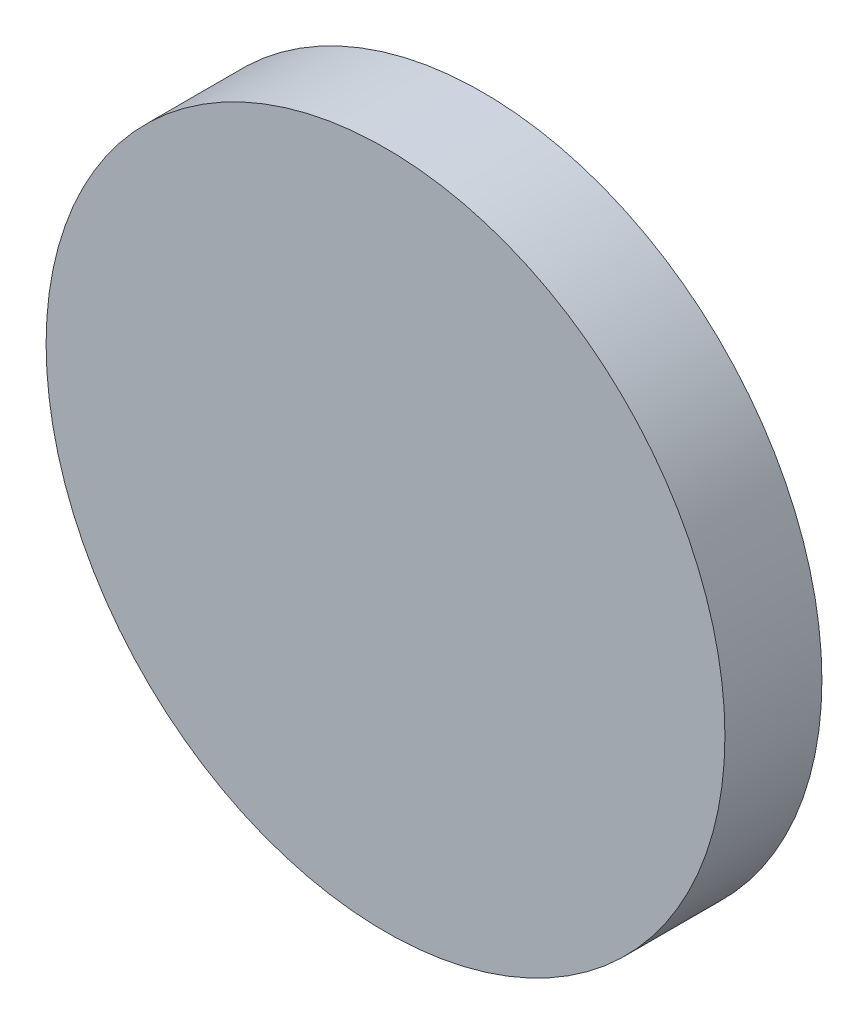
ISO-10303-21;
HEADER;
FILE_DESCRIPTION(('STEP AP214'),'2;1');
FILE_NAME('part.step','',(''),(''),'','','');
FILE_SCHEMA(('AUTOMOTIVE_DESIGN { 1 0 10303 214 1 1 1 1 }'));
ENDSEC;
DATA;
#1=APPLICATION_CONTEXT('core data for automotive mechanical design processes');
#2=APPLICATION_PROTOCOL_DEFINITION('international standard','automotive_design',2000,#1);
#3=PRODUCT_CONTEXT('',#1,'mechanical');
#4=PRODUCT('Part','Part','',(#3));
#5=PRODUCT_RELATED_PRODUCT_CATEGORY('part','',(#4));
#6=PRODUCT_DEFINITION_FORMATION('','',#4);
#7=PRODUCT_DEFINITION_CONTEXT('part definition',#1,'design');
#8=PRODUCT_DEFINITION('design','',#6,#7);
#9=PRODUCT_DEFINITION_SHAPE('','',#8);
#10=(LENGTH_UNIT() NAMED_UNIT(*) SI_UNIT(.MILLI.,.METRE.));
#11=(NAMED_UNIT(*) PLANE_ANGLE_UNIT() SI_UNIT($,.RADIAN.));
#12=(NAMED_UNIT(*) SI_UNIT($,.STERADIAN.) SOLID_ANGLE_UNIT());
#13=UNCERTAINTY_MEASURE_WITH_UNIT(LENGTH_MEASURE(1.E-05),#10,'distance_accuracy_value','');
#14=(GEOMETRIC_REPRESENTATION_CONTEXT(3) GLOBAL_UNCERTAINTY_ASSIGNED_CONTEXT((#13)) GLOBAL_UNIT_ASSIGNED_CONTEXT((#10,
#11,#12)) REPRESENTATION_CONTEXT('',''));
#15=CARTESIAN_POINT('',(0.,0.,0.));
#16=DIRECTION('',(0.,0.,1.));
#17=DIRECTION('',(1.,0.,0.));
#18=AXIS2_PLACEMENT_3D('',#15,#16,#17);
#19=CARTESIAN_POINT('',(0.,0.,0.4));
#20=DIRECTION('',(0.,0.,-1.));
#21=DIRECTION('',(-1.,0.,0.));
#22=AXIS2_PLACEMENT_3D('',#19,#20,#21);
#23=CYLINDRICAL_SURFACE('',#22,1.4);
#24=CARTESIAN_POINT('',(0.,0.,0.4));
#25=DIRECTION('',(0.,0.,1.));
#26=DIRECTION('',(1.,0.,0.));
#27=AXIS2_PLACEMENT_3D('',#24,#25,#26);
#28=CIRCLE('',#27,1.4);
#29=CARTESIAN_POINT('',(1.4,0.,0.4));
#30=VERTEX_POINT('',#29);
#31=EDGE_CURVE('E10',#30,#30,#28,.T.);
#32=ORIENTED_EDGE('',*,*,#31,.F.);
#33=EDGE_LOOP('',(#32));
#34=FACE_BOUND('',#33,.T.);
#35=CARTESIAN_POINT('',(0.,0.,0.));
#36=DIRECTION('',(0.,0.,1.));
#37=DIRECTION('',(1.,0.,0.));
#38=AXIS2_PLACEMENT_3D('',#35,#36,#37);
#39=CIRCLE('',#38,1.4);
#40=CARTESIAN_POINT('',(1.4,0.,0.));
#41=VERTEX_POINT('',#40);
#42=EDGE_CURVE('E37',#41,#41,#39,.T.);
#43=ORIENTED_EDGE('',*,*,#42,.T.);
#44=EDGE_LOOP('',(#43));
#45=FACE_BOUND('',#44,.T.);
#46=ADVANCED_FACE('F40',(#34,#45),#23,.T.);
#47=CARTESIAN_POINT('',(0.,0.,0.4));
#48=DIRECTION('',(0.,0.,1.));
#49=DIRECTION('',(1.,0.,0.));
#50=AXIS2_PLACEMENT_3D('',#47,#48,#49);
#51=PLANE('',#50);
#52=ORIENTED_EDGE('',*,*,#31,.T.);
#53=EDGE_LOOP('',(#52));
#54=FACE_BOUND('',#53,.T.);
#55=ADVANCED_FACE('F55',(#54),#51,.T.);
#56=CARTESIAN_POINT('',(0.,0.,0.));
#57=DIRECTION('',(0.,0.,1.));
#58=DIRECTION('',(1.,0.,0.));
#59=AXIS2_PLACEMENT_3D('',#56,#57,#58);
#60=PLANE('',#59);
#61=ORIENTED_EDGE('',*,*,#42,.F.);
#62=EDGE_LOOP('',(#61));
#63=FACE_BOUND('',#62,.T.);
#64=ADVANCED_FACE('F49',(#63),#60,.F.);
#65=CLOSED_SHELL('',(#46,#55,#64));
#66=MANIFOLD_SOLID_BREP('B2',#65);
#67=ADVANCED_BREP_SHAPE_REPRESENTATION('',(#18,#66),#14);
#68=SHAPE_DEFINITION_REPRESENTATION(#9,#67);
ENDSEC;
END-ISO-10303-21;
